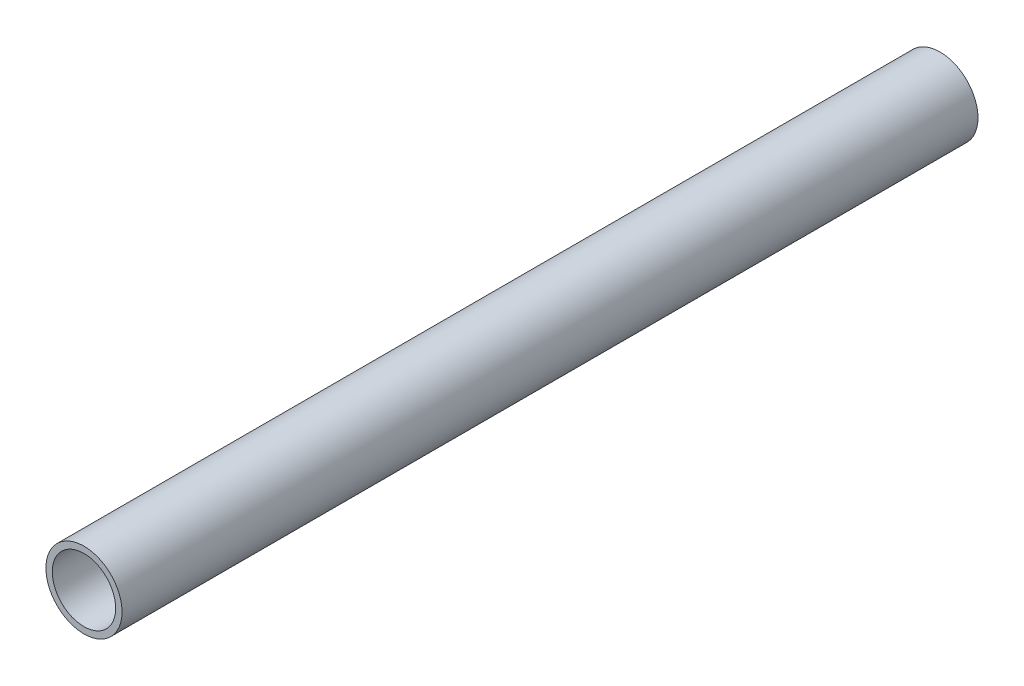
ISO-10303-21;
HEADER;
FILE_DESCRIPTION(('STEP AP214'),'2;1');
FILE_NAME('part.step','',(''),(''),'','','');
FILE_SCHEMA(('AUTOMOTIVE_DESIGN { 1 0 10303 214 1 1 1 1 }'));
ENDSEC;
DATA;
#1=APPLICATION_CONTEXT('core data for automotive mechanical design processes');
#2=APPLICATION_PROTOCOL_DEFINITION('international standard','automotive_design',2000,#1);
#3=PRODUCT_CONTEXT('',#1,'mechanical');
#4=PRODUCT('Part','Part','',(#3));
#5=PRODUCT_RELATED_PRODUCT_CATEGORY('part','',(#4));
#6=PRODUCT_DEFINITION_FORMATION('','',#4);
#7=PRODUCT_DEFINITION_CONTEXT('part definition',#1,'design');
#8=PRODUCT_DEFINITION('design','',#6,#7);
#9=PRODUCT_DEFINITION_SHAPE('','',#8);
#10=(LENGTH_UNIT() NAMED_UNIT(*) SI_UNIT(.MILLI.,.METRE.));
#11=(NAMED_UNIT(*) PLANE_ANGLE_UNIT() SI_UNIT($,.RADIAN.));
#12=(NAMED_UNIT(*) SI_UNIT($,.STERADIAN.) SOLID_ANGLE_UNIT());
#13=UNCERTAINTY_MEASURE_WITH_UNIT(LENGTH_MEASURE(1.E-05),#10,'distance_accuracy_value','');
#14=(GEOMETRIC_REPRESENTATION_CONTEXT(3) GLOBAL_UNCERTAINTY_ASSIGNED_CONTEXT((#13)) GLOBAL_UNIT_ASSIGNED_CONTEXT((#10,
#11,#12)) REPRESENTATION_CONTEXT('',''));
#15=CARTESIAN_POINT('',(0.,0.,0.));
#16=DIRECTION('',(0.,0.,1.));
#17=DIRECTION('',(1.,0.,0.));
#18=AXIS2_PLACEMENT_3D('',#15,#16,#17);
#19=CARTESIAN_POINT('',(0.,0.,135.));
#20=DIRECTION('',(0.,0.,1.));
#21=DIRECTION('',(1.,0.,0.));
#22=AXIS2_PLACEMENT_3D('',#19,#20,#21);
#23=PLANE('',#22);
#24=CARTESIAN_POINT('',(0.,0.,135.));
#25=DIRECTION('',(0.,0.,1.));
#26=DIRECTION('',(1.,0.,0.));
#27=AXIS2_PLACEMENT_3D('',#24,#25,#26);
#28=CIRCLE('',#27,6.);
#29=CARTESIAN_POINT('',(6.,0.,135.));
#30=VERTEX_POINT('',#29);
#31=EDGE_CURVE('E11',#30,#30,#28,.T.);
#32=ORIENTED_EDGE('',*,*,#31,.T.);
#33=EDGE_LOOP('',(#32));
#34=FACE_BOUND('',#33,.T.);
#35=CARTESIAN_POINT('',(0.,0.,135.));
#36=DIRECTION('',(0.,0.,1.));
#37=DIRECTION('',(1.,0.,0.));
#38=AXIS2_PLACEMENT_3D('',#35,#36,#37);
#39=CIRCLE('',#38,5.);
#40=CARTESIAN_POINT('',(5.,0.,135.));
#41=VERTEX_POINT('',#40);
#42=EDGE_CURVE('E51',#41,#41,#39,.T.);
#43=ORIENTED_EDGE('',*,*,#42,.F.);
#44=EDGE_LOOP('',(#43));
#45=FACE_BOUND('',#44,.T.);
#46=ADVANCED_FACE('F40',(#34,#45),#23,.T.);
#47=CARTESIAN_POINT('',(0.,0.,0.));
#48=DIRECTION('',(0.,0.,1.));
#49=DIRECTION('',(1.,0.,0.));
#50=AXIS2_PLACEMENT_3D('',#47,#48,#49);
#51=PLANE('',#50);
#52=CARTESIAN_POINT('',(0.,0.,0.));
#53=DIRECTION('',(0.,0.,1.));
#54=DIRECTION('',(1.,0.,0.));
#55=AXIS2_PLACEMENT_3D('',#52,#53,#54);
#56=CIRCLE('',#55,6.);
#57=CARTESIAN_POINT('',(6.,0.,0.));
#58=VERTEX_POINT('',#57);
#59=EDGE_CURVE('E44',#58,#58,#56,.T.);
#60=ORIENTED_EDGE('',*,*,#59,.F.);
#61=EDGE_LOOP('',(#60));
#62=FACE_BOUND('',#61,.T.);
#63=CARTESIAN_POINT('',(0.,0.,0.));
#64=DIRECTION('',(0.,0.,1.));
#65=DIRECTION('',(1.,0.,0.));
#66=AXIS2_PLACEMENT_3D('',#63,#64,#65);
#67=CIRCLE('',#66,5.);
#68=CARTESIAN_POINT('',(5.,0.,0.));
#69=VERTEX_POINT('',#68);
#70=EDGE_CURVE('E53',#69,#69,#67,.T.);
#71=ORIENTED_EDGE('',*,*,#70,.T.);
#72=EDGE_LOOP('',(#71));
#73=FACE_BOUND('',#72,.T.);
#74=ADVANCED_FACE('F63',(#62,#73),#51,.F.);
#75=CARTESIAN_POINT('',(0.,0.,135.));
#76=DIRECTION('',(0.,0.,-1.));
#77=DIRECTION('',(-1.,0.,0.));
#78=AXIS2_PLACEMENT_3D('',#75,#76,#77);
#79=CYLINDRICAL_SURFACE('',#78,6.);
#80=ORIENTED_EDGE('',*,*,#31,.F.);
#81=EDGE_LOOP('',(#80));
#82=FACE_BOUND('',#81,.T.);
#83=ORIENTED_EDGE('',*,*,#59,.T.);
#84=EDGE_LOOP('',(#83));
#85=FACE_BOUND('',#84,.T.);
#86=ADVANCED_FACE('F42',(#82,#85),#79,.T.);
#87=CARTESIAN_POINT('',(0.,0.,135.));
#88=DIRECTION('',(0.,0.,-1.));
#89=DIRECTION('',(-1.,0.,0.));
#90=AXIS2_PLACEMENT_3D('',#87,#88,#89);
#91=CYLINDRICAL_SURFACE('',#90,5.);
#92=ORIENTED_EDGE('',*,*,#42,.T.);
#93=EDGE_LOOP('',(#92));
#94=FACE_BOUND('',#93,.T.);
#95=ORIENTED_EDGE('',*,*,#70,.F.);
#96=EDGE_LOOP('',(#95));
#97=FACE_BOUND('',#96,.T.);
#98=ADVANCED_FACE('F59',(#94,#97),#91,.F.);
#99=CLOSED_SHELL('',(#46,#74,#86,#98));
#100=MANIFOLD_SOLID_BREP('B2',#99);
#101=ADVANCED_BREP_SHAPE_REPRESENTATION('',(#18,#100),#14);
#102=SHAPE_DEFINITION_REPRESENTATION(#9,#101);
ENDSEC;
END-ISO-10303-21;
